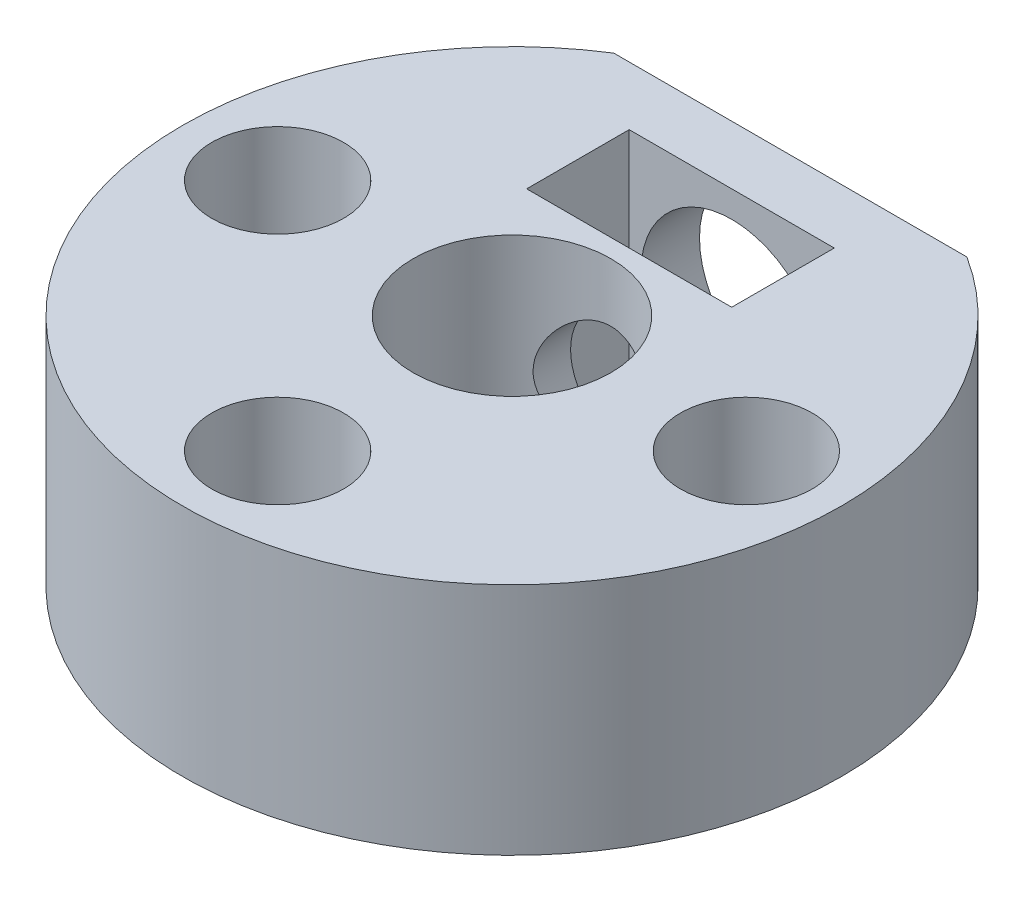
ISO-10303-21;
HEADER;
FILE_DESCRIPTION(('STEP AP214'),'2;1');
FILE_NAME('part.step','',(''),(''),'','','');
FILE_SCHEMA(('AUTOMOTIVE_DESIGN { 1 0 10303 214 1 1 1 1 }'));
ENDSEC;
DATA;
#1=APPLICATION_CONTEXT('core data for automotive mechanical design processes');
#2=APPLICATION_PROTOCOL_DEFINITION('international standard','automotive_design',2000,#1);
#3=PRODUCT_CONTEXT('',#1,'mechanical');
#4=PRODUCT('Part','Part','',(#3));
#5=PRODUCT_RELATED_PRODUCT_CATEGORY('part','',(#4));
#6=PRODUCT_DEFINITION_FORMATION('','',#4);
#7=PRODUCT_DEFINITION_CONTEXT('part definition',#1,'design');
#8=PRODUCT_DEFINITION('design','',#6,#7);
#9=PRODUCT_DEFINITION_SHAPE('','',#8);
#10=(LENGTH_UNIT() NAMED_UNIT(*) SI_UNIT(.MILLI.,.METRE.));
#11=(NAMED_UNIT(*) PLANE_ANGLE_UNIT() SI_UNIT($,.RADIAN.));
#12=(NAMED_UNIT(*) SI_UNIT($,.STERADIAN.) SOLID_ANGLE_UNIT());
#13=UNCERTAINTY_MEASURE_WITH_UNIT(LENGTH_MEASURE(1.E-05),#10,'distance_accuracy_value','');
#14=(GEOMETRIC_REPRESENTATION_CONTEXT(3) GLOBAL_UNCERTAINTY_ASSIGNED_CONTEXT((#13)) GLOBAL_UNIT_ASSIGNED_CONTEXT((#10,
#11,#12)) REPRESENTATION_CONTEXT('',''));
#15=CARTESIAN_POINT('',(0.,0.,0.));
#16=DIRECTION('',(0.,0.,1.));
#17=DIRECTION('',(1.,0.,0.));
#18=AXIS2_PLACEMENT_3D('',#15,#16,#17);
#19=CARTESIAN_POINT('',(0.,8.,0.));
#20=DIRECTION('',(0.,-1.,0.));
#21=DIRECTION('',(0.,0.,-1.));
#22=AXIS2_PLACEMENT_3D('',#19,#20,#21);
#23=CYLINDRICAL_SURFACE('',#22,11.25);
#24=CARTESIAN_POINT('',(0.,0.,0.));
#25=DIRECTION('',(0.,1.,0.));
#26=DIRECTION('',(0.,0.,1.));
#27=AXIS2_PLACEMENT_3D('',#24,#25,#26);
#28=CIRCLE('',#27,11.25);
#29=CARTESIAN_POINT('',(-6.02598539659698,0.,-9.5));
#30=VERTEX_POINT('',#29);
#31=CARTESIAN_POINT('',(6.02598539659698,0.,-9.5));
#32=VERTEX_POINT('',#31);
#33=EDGE_CURVE('E154',#30,#32,#28,.T.);
#34=ORIENTED_EDGE('',*,*,#33,.T.);
#35=DIRECTION('',(0.,-1.,0.));
#36=VECTOR('',#35,1.);
#37=CARTESIAN_POINT('',(6.02598539659698,8.,-9.5));
#38=LINE('',#37,#36);
#39=CARTESIAN_POINT('',(6.02598539659698,8.,-9.5));
#40=VERTEX_POINT('',#39);
#41=EDGE_CURVE('E11',#40,#32,#38,.T.);
#42=ORIENTED_EDGE('',*,*,#41,.F.);
#43=CARTESIAN_POINT('',(0.,8.,0.));
#44=DIRECTION('',(0.,1.,0.));
#45=DIRECTION('',(0.,0.,1.));
#46=AXIS2_PLACEMENT_3D('',#43,#44,#45);
#47=CIRCLE('',#46,11.25);
#48=CARTESIAN_POINT('',(-6.02598539659698,8.,-9.5));
#49=VERTEX_POINT('',#48);
#50=EDGE_CURVE('E158',#49,#40,#47,.T.);
#51=ORIENTED_EDGE('',*,*,#50,.F.);
#52=DIRECTION('',(0.,-1.,0.));
#53=VECTOR('',#52,1.);
#54=CARTESIAN_POINT('',(-6.02598539659698,8.,-9.5));
#55=LINE('',#54,#53);
#56=EDGE_CURVE('E53',#49,#30,#55,.T.);
#57=ORIENTED_EDGE('',*,*,#56,.T.);
#58=EDGE_LOOP('',(#34,#42,#51,#57));
#59=FACE_BOUND('',#58,.T.);
#60=ADVANCED_FACE('F39',(#59),#23,.T.);
#61=CARTESIAN_POINT('',(6.02598539659698,8.,-9.5));
#62=DIRECTION('',(0.,0.,1.));
#63=DIRECTION('',(1.,0.,0.));
#64=AXIS2_PLACEMENT_3D('',#61,#62,#63);
#65=PLANE('',#64);
#66=CARTESIAN_POINT('',(0.,4.,-9.5));
#67=DIRECTION('',(0.,0.,-1.));
#68=DIRECTION('',(-1.,0.,0.));
#69=AXIS2_PLACEMENT_3D('',#66,#67,#68);
#70=CIRCLE('',#69,3.1);
#71=CARTESIAN_POINT('',(-3.1,4.,-9.5));
#72=VERTEX_POINT('',#71);
#73=EDGE_CURVE('E434',#72,#72,#70,.T.);
#74=ORIENTED_EDGE('',*,*,#73,.F.);
#75=EDGE_LOOP('',(#74));
#76=FACE_BOUND('',#75,.T.);
#77=DIRECTION('',(-1.,0.,0.));
#78=VECTOR('',#77,1.);
#79=CARTESIAN_POINT('',(6.02598539659698,0.,-9.5));
#80=LINE('',#79,#78);
#81=EDGE_CURVE('E163',#32,#30,#80,.T.);
#82=ORIENTED_EDGE('',*,*,#81,.T.);
#83=ORIENTED_EDGE('',*,*,#56,.F.);
#84=DIRECTION('',(-1.,0.,0.));
#85=VECTOR('',#84,1.);
#86=CARTESIAN_POINT('',(6.02598539659698,8.,-9.5));
#87=LINE('',#86,#85);
#88=EDGE_CURVE('E162',#40,#49,#87,.T.);
#89=ORIENTED_EDGE('',*,*,#88,.F.);
#90=ORIENTED_EDGE('',*,*,#41,.T.);
#91=EDGE_LOOP('',(#82,#83,#89,#90));
#92=FACE_BOUND('',#91,.T.);
#93=ADVANCED_FACE('F180',(#76,#92),#65,.F.);
#94=CARTESIAN_POINT('',(0.,8.,0.));
#95=DIRECTION('',(0.,1.,0.));
#96=DIRECTION('',(0.,0.,1.));
#97=AXIS2_PLACEMENT_3D('',#94,#95,#96);
#98=PLANE('',#97);
#99=CARTESIAN_POINT('',(-8.,8.,0.));
#100=DIRECTION('',(0.,1.,0.));
#101=DIRECTION('',(0.,0.,1.));
#102=AXIS2_PLACEMENT_3D('',#99,#100,#101);
#103=CIRCLE('',#102,2.25);
#104=CARTESIAN_POINT('',(-8.,8.,2.25));
#105=VERTEX_POINT('',#104);
#106=EDGE_CURVE('E426',#105,#105,#103,.T.);
#107=ORIENTED_EDGE('',*,*,#106,.F.);
#108=EDGE_LOOP('',(#107));
#109=FACE_BOUND('',#108,.T.);
#110=CARTESIAN_POINT('',(0.,8.,8.));
#111=DIRECTION('',(0.,1.,0.));
#112=DIRECTION('',(0.,0.,1.));
#113=AXIS2_PLACEMENT_3D('',#110,#111,#112);
#114=CIRCLE('',#113,2.25);
#115=CARTESIAN_POINT('',(0.,8.,10.25));
#116=VERTEX_POINT('',#115);
#117=EDGE_CURVE('E410',#116,#116,#114,.T.);
#118=ORIENTED_EDGE('',*,*,#117,.F.);
#119=EDGE_LOOP('',(#118));
#120=FACE_BOUND('',#119,.T.);
#121=CARTESIAN_POINT('',(8.,8.,0.));
#122=DIRECTION('',(0.,1.,0.));
#123=DIRECTION('',(0.,0.,1.));
#124=AXIS2_PLACEMENT_3D('',#121,#122,#123);
#125=CIRCLE('',#124,2.25);
#126=CARTESIAN_POINT('',(8.,8.,2.25));
#127=VERTEX_POINT('',#126);
#128=EDGE_CURVE('E392',#127,#127,#125,.T.);
#129=ORIENTED_EDGE('',*,*,#128,.F.);
#130=EDGE_LOOP('',(#129));
#131=FACE_BOUND('',#130,.T.);
#132=DIRECTION('',(0.,0.,-1.));
#133=VECTOR('',#132,1.);
#134=CARTESIAN_POINT('',(3.5,8.,-4.));
#135=LINE('',#134,#133);
#136=CARTESIAN_POINT('',(3.5,8.,-4.));
#137=VERTEX_POINT('',#136);
#138=CARTESIAN_POINT('',(3.5,8.,-7.5));
#139=VERTEX_POINT('',#138);
#140=EDGE_CURVE('E60',#137,#139,#135,.T.);
#141=ORIENTED_EDGE('',*,*,#140,.F.);
#142=DIRECTION('',(1.,0.,0.));
#143=VECTOR('',#142,1.);
#144=CARTESIAN_POINT('',(-3.5,8.,-4.));
#145=LINE('',#144,#143);
#146=CARTESIAN_POINT('',(-3.5,8.,-4.));
#147=VERTEX_POINT('',#146);
#148=EDGE_CURVE('E119',#147,#137,#145,.T.);
#149=ORIENTED_EDGE('',*,*,#148,.F.);
#150=DIRECTION('',(0.,0.,1.));
#151=VECTOR('',#150,1.);
#152=CARTESIAN_POINT('',(-3.5,8.,-4.));
#153=LINE('',#152,#151);
#154=CARTESIAN_POINT('',(-3.5,8.,-7.5));
#155=VERTEX_POINT('',#154);
#156=EDGE_CURVE('E123',#155,#147,#153,.T.);
#157=ORIENTED_EDGE('',*,*,#156,.F.);
#158=DIRECTION('',(-1.,0.,0.));
#159=VECTOR('',#158,1.);
#160=CARTESIAN_POINT('',(-3.5,8.,-7.5));
#161=LINE('',#160,#159);
#162=EDGE_CURVE('E135',#139,#155,#161,.T.);
#163=ORIENTED_EDGE('',*,*,#162,.F.);
#164=EDGE_LOOP('',(#141,#149,#157,#163));
#165=FACE_BOUND('',#164,.T.);
#166=CARTESIAN_POINT('',(0.,8.,0.));
#167=DIRECTION('',(0.,1.,0.));
#168=DIRECTION('',(0.,0.,1.));
#169=AXIS2_PLACEMENT_3D('',#166,#167,#168);
#170=CIRCLE('',#169,3.375);
#171=CARTESIAN_POINT('',(0.,8.,3.375));
#172=VERTEX_POINT('',#171);
#173=EDGE_CURVE('E144',#172,#172,#170,.T.);
#174=ORIENTED_EDGE('',*,*,#173,.F.);
#175=EDGE_LOOP('',(#174));
#176=FACE_BOUND('',#175,.T.);
#177=ORIENTED_EDGE('',*,*,#50,.T.);
#178=ORIENTED_EDGE('',*,*,#88,.T.);
#179=EDGE_LOOP('',(#177,#178));
#180=FACE_BOUND('',#179,.T.);
#181=ADVANCED_FACE('F182',(#109,#120,#131,#165,#176,#180),#98,.T.);
#182=CARTESIAN_POINT('',(0.,0.,0.));
#183=DIRECTION('',(0.,1.,0.));
#184=DIRECTION('',(0.,0.,1.));
#185=AXIS2_PLACEMENT_3D('',#182,#183,#184);
#186=PLANE('',#185);
#187=CARTESIAN_POINT('',(-8.,0.,0.));
#188=DIRECTION('',(0.,1.,0.));
#189=DIRECTION('',(0.,0.,1.));
#190=AXIS2_PLACEMENT_3D('',#187,#188,#189);
#191=CIRCLE('',#190,1.25);
#192=CARTESIAN_POINT('',(-8.,0.,1.25));
#193=VERTEX_POINT('',#192);
#194=EDGE_CURVE('E414',#193,#193,#191,.T.);
#195=ORIENTED_EDGE('',*,*,#194,.T.);
#196=EDGE_LOOP('',(#195));
#197=FACE_BOUND('',#196,.T.);
#198=CARTESIAN_POINT('',(0.,0.,8.));
#199=DIRECTION('',(0.,1.,0.));
#200=DIRECTION('',(0.,0.,1.));
#201=AXIS2_PLACEMENT_3D('',#198,#199,#200);
#202=CIRCLE('',#201,1.25);
#203=CARTESIAN_POINT('',(0.,0.,9.25));
#204=VERTEX_POINT('',#203);
#205=EDGE_CURVE('E398',#204,#204,#202,.T.);
#206=ORIENTED_EDGE('',*,*,#205,.T.);
#207=EDGE_LOOP('',(#206));
#208=FACE_BOUND('',#207,.T.);
#209=CARTESIAN_POINT('',(8.,0.,0.));
#210=DIRECTION('',(0.,1.,0.));
#211=DIRECTION('',(0.,0.,1.));
#212=AXIS2_PLACEMENT_3D('',#209,#210,#211);
#213=CIRCLE('',#212,1.25);
#214=CARTESIAN_POINT('',(8.,0.,1.25));
#215=VERTEX_POINT('',#214);
#216=EDGE_CURVE('E126',#215,#215,#213,.T.);
#217=ORIENTED_EDGE('',*,*,#216,.T.);
#218=EDGE_LOOP('',(#217));
#219=FACE_BOUND('',#218,.T.);
#220=DIRECTION('',(1.,0.,0.));
#221=VECTOR('',#220,1.);
#222=CARTESIAN_POINT('',(-3.5,0.,-4.));
#223=LINE('',#222,#221);
#224=CARTESIAN_POINT('',(-3.5,0.,-4.));
#225=VERTEX_POINT('',#224);
#226=CARTESIAN_POINT('',(3.5,0.,-4.));
#227=VERTEX_POINT('',#226);
#228=EDGE_CURVE('E107',#225,#227,#223,.T.);
#229=ORIENTED_EDGE('',*,*,#228,.T.);
#230=DIRECTION('',(0.,0.,-1.));
#231=VECTOR('',#230,1.);
#232=CARTESIAN_POINT('',(3.5,0.,-4.));
#233=LINE('',#232,#231);
#234=CARTESIAN_POINT('',(3.5,0.,-7.5));
#235=VERTEX_POINT('',#234);
#236=EDGE_CURVE('E100',#227,#235,#233,.T.);
#237=ORIENTED_EDGE('',*,*,#236,.T.);
#238=DIRECTION('',(-1.,0.,0.));
#239=VECTOR('',#238,1.);
#240=CARTESIAN_POINT('',(-3.5,0.,-7.5));
#241=LINE('',#240,#239);
#242=CARTESIAN_POINT('',(-3.5,0.,-7.5));
#243=VERTEX_POINT('',#242);
#244=EDGE_CURVE('E110',#235,#243,#241,.T.);
#245=ORIENTED_EDGE('',*,*,#244,.T.);
#246=DIRECTION('',(0.,0.,1.));
#247=VECTOR('',#246,1.);
#248=CARTESIAN_POINT('',(-3.5,0.,-4.));
#249=LINE('',#248,#247);
#250=EDGE_CURVE('E68',#243,#225,#249,.T.);
#251=ORIENTED_EDGE('',*,*,#250,.T.);
#252=EDGE_LOOP('',(#229,#237,#245,#251));
#253=FACE_BOUND('',#252,.T.);
#254=CARTESIAN_POINT('',(0.,0.,0.));
#255=DIRECTION('',(0.,1.,0.));
#256=DIRECTION('',(0.,0.,1.));
#257=AXIS2_PLACEMENT_3D('',#254,#255,#256);
#258=CIRCLE('',#257,3.375);
#259=CARTESIAN_POINT('',(0.,0.,3.375));
#260=VERTEX_POINT('',#259);
#261=EDGE_CURVE('E150',#260,#260,#258,.T.);
#262=ORIENTED_EDGE('',*,*,#261,.T.);
#263=EDGE_LOOP('',(#262));
#264=FACE_BOUND('',#263,.T.);
#265=ORIENTED_EDGE('',*,*,#33,.F.);
#266=ORIENTED_EDGE('',*,*,#81,.F.);
#267=EDGE_LOOP('',(#265,#266));
#268=FACE_BOUND('',#267,.T.);
#269=ADVANCED_FACE('F115',(#197,#208,#219,#253,#264,#268),#186,.F.);
#270=CARTESIAN_POINT('',(0.,0.,0.));
#271=DIRECTION('',(0.,1.,0.));
#272=DIRECTION('',(0.,0.,1.));
#273=AXIS2_PLACEMENT_3D('',#270,#271,#272);
#274=CYLINDRICAL_SURFACE('',#273,3.375);
#275=CARTESIAN_POINT('',(-2.,4.,-2.71857039636644));
#276=CARTESIAN_POINT('',(-2.00000302005978,4.10093656169047,-2.71856624475387));
#277=CARTESIAN_POINT('',(-1.99231217938209,4.20185789729625,-2.72427590593308));
#278=CARTESIAN_POINT('',(-1.96209936884802,4.40032923373294,-2.74611066877484));
#279=CARTESIAN_POINT('',(-1.93956215340677,4.49787566041339,-2.76224647661076));
#280=CARTESIAN_POINT('',(-1.88113400144247,4.68630386175832,-2.80235424552315));
#281=CARTESIAN_POINT('',(-1.8453367327096,4.77722715496814,-2.82627110109562));
#282=CARTESIAN_POINT('',(-1.76170207463345,4.95172369697022,-2.87914483816479));
#283=CARTESIAN_POINT('',(-1.7138609372636,5.03529464678332,-2.90810328772804));
#284=CARTESIAN_POINT('',(-1.60085999612088,5.2036235604198,-2.97196274924336));
#285=CARTESIAN_POINT('',(-1.53431713506507,5.28734054558201,-3.00716090709141));
#286=CARTESIAN_POINT('',(-1.38863939804685,5.44328669280442,-3.07714884290393));
#287=CARTESIAN_POINT('',(-1.30949545418994,5.5155075066599,-3.11193830726021));
#288=CARTESIAN_POINT('',(-1.13082813326993,5.653868511511,-3.18150341377652));
#289=CARTESIAN_POINT('',(-1.03003952399458,5.71858541775183,-3.21589798040981));
#290=CARTESIAN_POINT('',(-0.816579339803555,5.82965341821226,-3.27659759842655));
#291=CARTESIAN_POINT('',(-0.703918493012731,5.87602091635399,-3.30290987045169));
#292=CARTESIAN_POINT('',(-0.481056838073759,5.94444564525355,-3.34227308082225));
#293=CARTESIAN_POINT('',(-0.371613149432158,5.96837239685891,-3.3563349211567));
#294=CARTESIAN_POINT('',(-0.149452457498916,5.99754372521515,-3.37352322783196));
#295=CARTESIAN_POINT('',(-0.036738525366294,6.00280529265913,-3.37665963941244));
#296=CARTESIAN_POINT('',(0.174054629669656,5.994859391292,-3.37195650209562));
#297=CARTESIAN_POINT('',(0.272253852368319,5.98381039632812,-3.36539957284306));
#298=CARTESIAN_POINT('',(0.465107054066476,5.94763957712779,-3.34420540017995));
#299=CARTESIAN_POINT('',(0.559760770391415,5.92251671239737,-3.32956755934145));
#300=CARTESIAN_POINT('',(0.743821007189801,5.8591066283179,-3.29336042555524));
#301=CARTESIAN_POINT('',(0.833188358010073,5.82073279960987,-3.27174559262747));
#302=CARTESIAN_POINT('',(1.0043358362359,5.73222439697394,-3.22332983745497));
#303=CARTESIAN_POINT('',(1.08611391399774,5.68208665877825,-3.19652752021592));
#304=CARTESIAN_POINT('',(1.25008957379127,5.56480104191742,-3.13630336181635));
#305=CARTESIAN_POINT('',(1.33120076052291,5.4963448488155,-3.10247365624232));
#306=CARTESIAN_POINT('',(1.481471385522,5.34774998765144,-3.03359800740311));
#307=CARTESIAN_POINT('',(1.55061479295524,5.26759591099432,-2.99855050716708));
#308=CARTESIAN_POINT('',(1.68277087523207,5.087262428334,-2.92663119970711));
#309=CARTESIAN_POINT('',(1.74423811625785,4.98584647009265,-2.8899923269836));
#310=CARTESIAN_POINT('',(1.84889893671708,4.7718128611224,-2.82418880602174));
#311=CARTESIAN_POINT('',(1.89212596239425,4.65921618462214,-2.79501051672545));
#312=CARTESIAN_POINT('',(1.94993605264602,4.45407831525546,-2.75486801584028));
#313=CARTESIAN_POINT('',(1.96892617195287,4.36330821045562,-2.74120121569528));
#314=CARTESIAN_POINT('',(1.99412033204843,4.1791514232301,-2.72293296810409));
#315=CARTESIAN_POINT('',(2.00033852732913,4.08576775380235,-2.7183214853469));
#316=CARTESIAN_POINT('',(1.99963237633693,3.89897487056664,-2.71884071272461));
#317=CARTESIAN_POINT('',(1.99269282736926,3.80556575204459,-2.72398269218832));
#318=CARTESIAN_POINT('',(1.9660652963402,3.62151703042022,-2.74325921761662));
#319=CARTESIAN_POINT('',(1.94636742562879,3.53087963272083,-2.75740073874802));
#320=CARTESIAN_POINT('',(1.89513564458556,3.35428662428289,-2.7928563817203));
#321=CARTESIAN_POINT('',(1.86357009296111,3.26834423912425,-2.81418966218189));
#322=CARTESIAN_POINT('',(1.78970733302349,3.10267937766082,-2.86173000398059));
#323=CARTESIAN_POINT('',(1.74740599198254,3.02295931211716,-2.88793894115552));
#324=CARTESIAN_POINT('',(1.64463809558542,2.85706703494325,-2.94786671815241));
#325=CARTESIAN_POINT('',(1.58228204466371,2.77224701794787,-2.98209398058185));
#326=CARTESIAN_POINT('',(1.44513234341638,2.61341518010118,-3.05092036995606));
#327=CARTESIAN_POINT('',(1.37032717129052,2.53941349203342,-3.08551981335088));
#328=CARTESIAN_POINT('',(1.19948295158788,2.39525813152264,-3.15616950946421));
#329=CARTESIAN_POINT('',(1.10196751438476,2.3266699375699,-3.19188351225946));
#330=CARTESIAN_POINT('',(0.894484546234651,2.2071824585684,-3.25611456561532));
#331=CARTESIAN_POINT('',(0.784525869555467,2.15627069909756,-3.28463668764494));
#332=CARTESIAN_POINT('',(0.563831590961332,2.07782733997892,-3.32932663402442));
#333=CARTESIAN_POINT('',(0.453781825306049,2.04882039917497,-3.34626480351807));
#334=CARTESIAN_POINT('',(0.229273760406813,2.00993168406592,-3.36908590715018));
#335=CARTESIAN_POINT('',(0.114820281655922,2.00002957196272,-3.37498059728765));
#336=CARTESIAN_POINT('',(-0.099255647503966,1.99997431825698,-3.37501685514392));
#337=CARTESIAN_POINT('',(-0.198887341704873,2.00743911461743,-3.37057602144284));
#338=CARTESIAN_POINT('',(-0.395201272337012,2.03692456251692,-3.35322935342601));
#339=CARTESIAN_POINT('',(-0.491883438570622,2.05894556020563,-3.34032331780594));
#340=CARTESIAN_POINT('',(-0.678723371390912,2.11617788827633,-3.30739662882226));
#341=CARTESIAN_POINT('',(-0.768941457351292,2.15124068347228,-3.28745621826425));
#342=CARTESIAN_POINT('',(-0.942256748401966,2.23326478535814,-3.24203845635122));
#343=CARTESIAN_POINT('',(-1.0253522737492,2.28022888850743,-3.2165598038717));
#344=CARTESIAN_POINT('',(-1.19184429043909,2.39048484464602,-3.15891055697649));
#345=CARTESIAN_POINT('',(-1.27428108890741,2.45500022670008,-3.12631292077458));
#346=CARTESIAN_POINT('',(-1.42781035598212,2.59564359637172,-3.05925106798505));
#347=CARTESIAN_POINT('',(-1.49888963242232,2.67178489010213,-3.02478474216799));
#348=CARTESIAN_POINT('',(-1.63650357185963,2.84437346006317,-2.95283068130418));
#349=CARTESIAN_POINT('',(-1.70144098002321,2.94216354560416,-2.91548361408817));
#350=CARTESIAN_POINT('',(-1.81387022978564,3.14928015499329,-2.84690192226116));
#351=CARTESIAN_POINT('',(-1.86137699957625,3.25859670338849,-2.81566207798115));
#352=CARTESIAN_POINT('',(-1.93193991697265,3.47216141069209,-2.76764108086213));
#353=CARTESIAN_POINT('',(-1.95730977056216,3.57533562867863,-2.74954088787137));
#354=CARTESIAN_POINT('',(-1.99132342248482,3.78568389411879,-2.72501807210973));
#355=CARTESIAN_POINT('',(-1.99999679404756,3.89285052615124,-2.71857480352174));
#356=CARTESIAN_POINT('',(-2.,4.,-2.71857039636644));
#357=B_SPLINE_CURVE_WITH_KNOTS('',3,(#275,#276,#277,#278,#279,#280,#281,#282,#283,#284,#285,
#286,#287,#288,#289,#290,#291,#292,#293,#294,#295,#296,#297,#298,#299,#300,#301,#302,#303,#304,
#305,#306,#307,#308,#309,#310,#311,#312,#313,#314,#315,#316,#317,#318,#319,#320,#321,#322,#323,
#324,#325,#326,#327,#328,#329,#330,#331,#332,#333,#334,#335,#336,#337,#338,#339,#340,#341,#342,
#343,#344,#345,#346,#347,#348,#349,#350,#351,#352,#353,#354,#355,#356),.UNSPECIFIED.,.T.,.F.,(4,
2,2,2,2,2,2,2,2,2,2,2,2,2,2,2,2,2,2,2,2,2,2,2,2,2,2,2,2,2,2,2,2,2,2,2,2,2,2,2,4),(0.,
0.302360678353001,0.605032332703908,0.905605494553531,1.206272310016,1.54269894028003,
1.87936877069471,2.25120772319724,2.62271350575031,2.95943913016693,3.29585815852415,
3.59155571200407,3.88727512955783,4.18496517010454,4.48273537558908,4.8155985740299,
5.14890424884448,5.51940827976303,5.88922995075223,6.16922925104124,6.44891807414801,
6.72893025169874,7.00915971968349,7.29014168818266,7.57123198481173,7.90203229994899,
8.23314049468283,8.60456188344308,8.9757206213904,9.31884862310958,9.66161115037751,
9.96017274291591,10.2587414355701,10.5540089098362,10.84934582776,11.1769612289252,
11.504954443407,11.8727355647971,12.2402009666078,12.5617427927892,12.8827145700668),.UNSPECIFIED.);
#358=CARTESIAN_POINT('',(-2.,4.,-2.71857039636644));
#359=VERTEX_POINT('',#358);
#360=EDGE_CURVE('E42',#359,#359,#357,.T.);
#361=ORIENTED_EDGE('',*,*,#360,.T.);
#362=EDGE_LOOP('',(#361));
#363=FACE_BOUND('',#362,.T.);
#364=ORIENTED_EDGE('',*,*,#261,.F.);
#365=EDGE_LOOP('',(#364));
#366=FACE_BOUND('',#365,.T.);
#367=ORIENTED_EDGE('',*,*,#173,.T.);
#368=EDGE_LOOP('',(#367));
#369=FACE_BOUND('',#368,.T.);
#370=ADVANCED_FACE('F190',(#363,#366,#369),#274,.F.);
#371=CARTESIAN_POINT('',(3.5,0.,-4.));
#372=DIRECTION('',(1.,0.,0.));
#373=DIRECTION('',(0.,0.,-1.));
#374=AXIS2_PLACEMENT_3D('',#371,#372,#373);
#375=PLANE('',#374);
#376=ORIENTED_EDGE('',*,*,#140,.T.);
#377=DIRECTION('',(0.,1.,0.));
#378=VECTOR('',#377,1.);
#379=CARTESIAN_POINT('',(3.5,0.,-7.5));
#380=LINE('',#379,#378);
#381=EDGE_CURVE('E96',#235,#139,#380,.T.);
#382=ORIENTED_EDGE('',*,*,#381,.F.);
#383=ORIENTED_EDGE('',*,*,#236,.F.);
#384=DIRECTION('',(0.,1.,0.));
#385=VECTOR('',#384,1.);
#386=CARTESIAN_POINT('',(3.5,0.,-4.));
#387=LINE('',#386,#385);
#388=EDGE_CURVE('E141',#227,#137,#387,.T.);
#389=ORIENTED_EDGE('',*,*,#388,.T.);
#390=EDGE_LOOP('',(#376,#382,#383,#389));
#391=FACE_BOUND('',#390,.T.);
#392=ADVANCED_FACE('F98',(#391),#375,.F.);
#393=CARTESIAN_POINT('',(-3.5,0.,-4.));
#394=DIRECTION('',(0.,0.,1.));
#395=DIRECTION('',(1.,0.,0.));
#396=AXIS2_PLACEMENT_3D('',#393,#394,#395);
#397=PLANE('',#396);
#398=CARTESIAN_POINT('',(0.,4.,-4.));
#399=DIRECTION('',(0.,0.,1.));
#400=DIRECTION('',(1.,0.,0.));
#401=AXIS2_PLACEMENT_3D('',#398,#399,#400);
#402=CIRCLE('',#401,2.);
#403=CARTESIAN_POINT('',(2.,4.,-4.));
#404=VERTEX_POINT('',#403);
#405=EDGE_CURVE('E430',#404,#404,#402,.T.);
#406=ORIENTED_EDGE('',*,*,#405,.T.);
#407=EDGE_LOOP('',(#406));
#408=FACE_BOUND('',#407,.T.);
#409=ORIENTED_EDGE('',*,*,#148,.T.);
#410=ORIENTED_EDGE('',*,*,#388,.F.);
#411=ORIENTED_EDGE('',*,*,#228,.F.);
#412=DIRECTION('',(0.,1.,0.));
#413=VECTOR('',#412,1.);
#414=CARTESIAN_POINT('',(-3.5,0.,-4.));
#415=LINE('',#414,#413);
#416=EDGE_CURVE('E145',#225,#147,#415,.T.);
#417=ORIENTED_EDGE('',*,*,#416,.T.);
#418=EDGE_LOOP('',(#409,#410,#411,#417));
#419=FACE_BOUND('',#418,.T.);
#420=ADVANCED_FACE('F227',(#408,#419),#397,.F.);
#421=CARTESIAN_POINT('',(-3.5,0.,-4.));
#422=DIRECTION('',(-1.,0.,0.));
#423=DIRECTION('',(0.,0.,1.));
#424=AXIS2_PLACEMENT_3D('',#421,#422,#423);
#425=PLANE('',#424);
#426=ORIENTED_EDGE('',*,*,#156,.T.);
#427=ORIENTED_EDGE('',*,*,#416,.F.);
#428=ORIENTED_EDGE('',*,*,#250,.F.);
#429=DIRECTION('',(0.,1.,0.));
#430=VECTOR('',#429,1.);
#431=CARTESIAN_POINT('',(-3.5,0.,-7.5));
#432=LINE('',#431,#430);
#433=EDGE_CURVE('E106',#243,#155,#432,.T.);
#434=ORIENTED_EDGE('',*,*,#433,.T.);
#435=EDGE_LOOP('',(#426,#427,#428,#434));
#436=FACE_BOUND('',#435,.T.);
#437=ADVANCED_FACE('F232',(#436),#425,.F.);
#438=CARTESIAN_POINT('',(-3.5,0.,-7.5));
#439=DIRECTION('',(0.,0.,-1.));
#440=DIRECTION('',(-1.,0.,0.));
#441=AXIS2_PLACEMENT_3D('',#438,#439,#440);
#442=PLANE('',#441);
#443=CARTESIAN_POINT('',(0.,4.,-7.5));
#444=DIRECTION('',(0.,0.,-1.));
#445=DIRECTION('',(-1.,0.,0.));
#446=AXIS2_PLACEMENT_3D('',#443,#444,#445);
#447=CIRCLE('',#446,3.1);
#448=CARTESIAN_POINT('',(-3.1,4.,-7.5));
#449=VERTEX_POINT('',#448);
#450=EDGE_CURVE('E438',#449,#449,#447,.T.);
#451=ORIENTED_EDGE('',*,*,#450,.T.);
#452=EDGE_LOOP('',(#451));
#453=FACE_BOUND('',#452,.T.);
#454=ORIENTED_EDGE('',*,*,#162,.T.);
#455=ORIENTED_EDGE('',*,*,#433,.F.);
#456=ORIENTED_EDGE('',*,*,#244,.F.);
#457=ORIENTED_EDGE('',*,*,#381,.T.);
#458=EDGE_LOOP('',(#454,#455,#456,#457));
#459=FACE_BOUND('',#458,.T.);
#460=ADVANCED_FACE('F111',(#453,#459),#442,.F.);
#461=CARTESIAN_POINT('',(8.,8.,0.));
#462=DIRECTION('',(0.,1.,0.));
#463=DIRECTION('',(0.,0.,1.));
#464=AXIS2_PLACEMENT_3D('',#461,#462,#463);
#465=CYLINDRICAL_SURFACE('',#464,1.25);
#466=ORIENTED_EDGE('',*,*,#216,.F.);
#467=EDGE_LOOP('',(#466));
#468=FACE_BOUND('',#467,.T.);
#469=CARTESIAN_POINT('',(8.,2.7,0.));
#470=DIRECTION('',(0.,1.,0.));
#471=DIRECTION('',(0.,0.,1.));
#472=AXIS2_PLACEMENT_3D('',#469,#470,#471);
#473=CIRCLE('',#472,1.25);
#474=CARTESIAN_POINT('',(8.,2.7,1.25));
#475=VERTEX_POINT('',#474);
#476=EDGE_CURVE('E386',#475,#475,#473,.T.);
#477=ORIENTED_EDGE('',*,*,#476,.T.);
#478=EDGE_LOOP('',(#477));
#479=FACE_BOUND('',#478,.T.);
#480=ADVANCED_FACE('F244',(#468,#479),#465,.F.);
#481=CARTESIAN_POINT('',(9.25,2.7,0.));
#482=DIRECTION('',(0.,-1.,0.));
#483=DIRECTION('',(0.,0.,-1.));
#484=AXIS2_PLACEMENT_3D('',#481,#482,#483);
#485=PLANE('',#484);
#486=ORIENTED_EDGE('',*,*,#476,.F.);
#487=EDGE_LOOP('',(#486));
#488=FACE_BOUND('',#487,.T.);
#489=CARTESIAN_POINT('',(8.,2.7,0.));
#490=DIRECTION('',(0.,1.,0.));
#491=DIRECTION('',(0.,0.,1.));
#492=AXIS2_PLACEMENT_3D('',#489,#490,#491);
#493=CIRCLE('',#492,2.25);
#494=CARTESIAN_POINT('',(8.,2.7,2.25));
#495=VERTEX_POINT('',#494);
#496=EDGE_CURVE('E388',#495,#495,#493,.T.);
#497=ORIENTED_EDGE('',*,*,#496,.T.);
#498=EDGE_LOOP('',(#497));
#499=FACE_BOUND('',#498,.T.);
#500=ADVANCED_FACE('F299',(#488,#499),#485,.F.);
#501=CARTESIAN_POINT('',(8.,8.,0.));
#502=DIRECTION('',(0.,1.,0.));
#503=DIRECTION('',(0.,0.,1.));
#504=AXIS2_PLACEMENT_3D('',#501,#502,#503);
#505=CYLINDRICAL_SURFACE('',#504,2.25);
#506=ORIENTED_EDGE('',*,*,#496,.F.);
#507=EDGE_LOOP('',(#506));
#508=FACE_BOUND('',#507,.T.);
#509=ORIENTED_EDGE('',*,*,#128,.T.);
#510=EDGE_LOOP('',(#509));
#511=FACE_BOUND('',#510,.T.);
#512=ADVANCED_FACE('F295',(#508,#511),#505,.F.);
#513=CARTESIAN_POINT('',(0.,8.,8.));
#514=DIRECTION('',(0.,1.,0.));
#515=DIRECTION('',(0.,0.,1.));
#516=AXIS2_PLACEMENT_3D('',#513,#514,#515);
#517=CYLINDRICAL_SURFACE('',#516,1.25);
#518=ORIENTED_EDGE('',*,*,#205,.F.);
#519=EDGE_LOOP('',(#518));
#520=FACE_BOUND('',#519,.T.);
#521=CARTESIAN_POINT('',(0.,2.7,8.));
#522=DIRECTION('',(0.,1.,0.));
#523=DIRECTION('',(0.,0.,1.));
#524=AXIS2_PLACEMENT_3D('',#521,#522,#523);
#525=CIRCLE('',#524,1.25);
#526=CARTESIAN_POINT('',(0.,2.7,9.25));
#527=VERTEX_POINT('',#526);
#528=EDGE_CURVE('E402',#527,#527,#525,.T.);
#529=ORIENTED_EDGE('',*,*,#528,.T.);
#530=EDGE_LOOP('',(#529));
#531=FACE_BOUND('',#530,.T.);
#532=ADVANCED_FACE('F291',(#520,#531),#517,.F.);
#533=CARTESIAN_POINT('',(1.25,2.7,8.));
#534=DIRECTION('',(0.,-1.,0.));
#535=DIRECTION('',(0.,0.,-1.));
#536=AXIS2_PLACEMENT_3D('',#533,#534,#535);
#537=PLANE('',#536);
#538=ORIENTED_EDGE('',*,*,#528,.F.);
#539=EDGE_LOOP('',(#538));
#540=FACE_BOUND('',#539,.T.);
#541=CARTESIAN_POINT('',(0.,2.7,8.));
#542=DIRECTION('',(0.,1.,0.));
#543=DIRECTION('',(0.,0.,1.));
#544=AXIS2_PLACEMENT_3D('',#541,#542,#543);
#545=CIRCLE('',#544,2.25);
#546=CARTESIAN_POINT('',(0.,2.7,10.25));
#547=VERTEX_POINT('',#546);
#548=EDGE_CURVE('E406',#547,#547,#545,.T.);
#549=ORIENTED_EDGE('',*,*,#548,.T.);
#550=EDGE_LOOP('',(#549));
#551=FACE_BOUND('',#550,.T.);
#552=ADVANCED_FACE('F287',(#540,#551),#537,.F.);
#553=CARTESIAN_POINT('',(0.,8.,8.));
#554=DIRECTION('',(0.,1.,0.));
#555=DIRECTION('',(0.,0.,1.));
#556=AXIS2_PLACEMENT_3D('',#553,#554,#555);
#557=CYLINDRICAL_SURFACE('',#556,2.25);
#558=ORIENTED_EDGE('',*,*,#548,.F.);
#559=EDGE_LOOP('',(#558));
#560=FACE_BOUND('',#559,.T.);
#561=ORIENTED_EDGE('',*,*,#117,.T.);
#562=EDGE_LOOP('',(#561));
#563=FACE_BOUND('',#562,.T.);
#564=ADVANCED_FACE('F283',(#560,#563),#557,.F.);
#565=CARTESIAN_POINT('',(-8.,8.,0.));
#566=DIRECTION('',(0.,1.,0.));
#567=DIRECTION('',(0.,0.,1.));
#568=AXIS2_PLACEMENT_3D('',#565,#566,#567);
#569=CYLINDRICAL_SURFACE('',#568,1.25);
#570=ORIENTED_EDGE('',*,*,#194,.F.);
#571=EDGE_LOOP('',(#570));
#572=FACE_BOUND('',#571,.T.);
#573=CARTESIAN_POINT('',(-8.,2.7,0.));
#574=DIRECTION('',(0.,1.,0.));
#575=DIRECTION('',(0.,0.,1.));
#576=AXIS2_PLACEMENT_3D('',#573,#574,#575);
#577=CIRCLE('',#576,1.25);
#578=CARTESIAN_POINT('',(-8.,2.7,1.25));
#579=VERTEX_POINT('',#578);
#580=EDGE_CURVE('E418',#579,#579,#577,.T.);
#581=ORIENTED_EDGE('',*,*,#580,.T.);
#582=EDGE_LOOP('',(#581));
#583=FACE_BOUND('',#582,.T.);
#584=ADVANCED_FACE('F279',(#572,#583),#569,.F.);
#585=CARTESIAN_POINT('',(-6.75,2.7,0.));
#586=DIRECTION('',(0.,-1.,0.));
#587=DIRECTION('',(0.,0.,-1.));
#588=AXIS2_PLACEMENT_3D('',#585,#586,#587);
#589=PLANE('',#588);
#590=ORIENTED_EDGE('',*,*,#580,.F.);
#591=EDGE_LOOP('',(#590));
#592=FACE_BOUND('',#591,.T.);
#593=CARTESIAN_POINT('',(-8.,2.7,0.));
#594=DIRECTION('',(0.,1.,0.));
#595=DIRECTION('',(0.,0.,1.));
#596=AXIS2_PLACEMENT_3D('',#593,#594,#595);
#597=CIRCLE('',#596,2.25);
#598=CARTESIAN_POINT('',(-8.,2.7,2.25));
#599=VERTEX_POINT('',#598);
#600=EDGE_CURVE('E422',#599,#599,#597,.T.);
#601=ORIENTED_EDGE('',*,*,#600,.T.);
#602=EDGE_LOOP('',(#601));
#603=FACE_BOUND('',#602,.T.);
#604=ADVANCED_FACE('F275',(#592,#603),#589,.F.);
#605=CARTESIAN_POINT('',(-8.,8.,0.));
#606=DIRECTION('',(0.,1.,0.));
#607=DIRECTION('',(0.,0.,1.));
#608=AXIS2_PLACEMENT_3D('',#605,#606,#607);
#609=CYLINDRICAL_SURFACE('',#608,2.25);
#610=ORIENTED_EDGE('',*,*,#600,.F.);
#611=EDGE_LOOP('',(#610));
#612=FACE_BOUND('',#611,.T.);
#613=ORIENTED_EDGE('',*,*,#106,.T.);
#614=EDGE_LOOP('',(#613));
#615=FACE_BOUND('',#614,.T.);
#616=ADVANCED_FACE('F211',(#612,#615),#609,.F.);
#617=CARTESIAN_POINT('',(0.,4.,-9.5));
#618=DIRECTION('',(0.,0.,-1.));
#619=DIRECTION('',(-1.,0.,0.));
#620=AXIS2_PLACEMENT_3D('',#617,#618,#619);
#621=CYLINDRICAL_SURFACE('',#620,2.);
#622=ORIENTED_EDGE('',*,*,#360,.F.);
#623=EDGE_LOOP('',(#622));
#624=FACE_BOUND('',#623,.T.);
#625=ORIENTED_EDGE('',*,*,#405,.F.);
#626=EDGE_LOOP('',(#625));
#627=FACE_BOUND('',#626,.T.);
#628=ADVANCED_FACE('F252',(#624,#627),#621,.F.);
#629=CARTESIAN_POINT('',(0.,4.,-9.5));
#630=DIRECTION('',(0.,0.,-1.));
#631=DIRECTION('',(-1.,0.,0.));
#632=AXIS2_PLACEMENT_3D('',#629,#630,#631);
#633=CYLINDRICAL_SURFACE('',#632,3.1);
#634=ORIENTED_EDGE('',*,*,#450,.F.);
#635=EDGE_LOOP('',(#634));
#636=FACE_BOUND('',#635,.T.);
#637=ORIENTED_EDGE('',*,*,#73,.T.);
#638=EDGE_LOOP('',(#637));
#639=FACE_BOUND('',#638,.T.);
#640=ADVANCED_FACE('F257',(#636,#639),#633,.F.);
#641=CLOSED_SHELL('',(#60,#93,#181,#269,#370,#392,#420,#437,#460,#480,#500,#512,#532,#552,#564,
#584,#604,#616,#628,#640));
#642=MANIFOLD_SOLID_BREP('B2',#641);
#643=ADVANCED_BREP_SHAPE_REPRESENTATION('',(#18,#642),#14);
#644=SHAPE_DEFINITION_REPRESENTATION(#9,#643);
ENDSEC;
END-ISO-10303-21;
